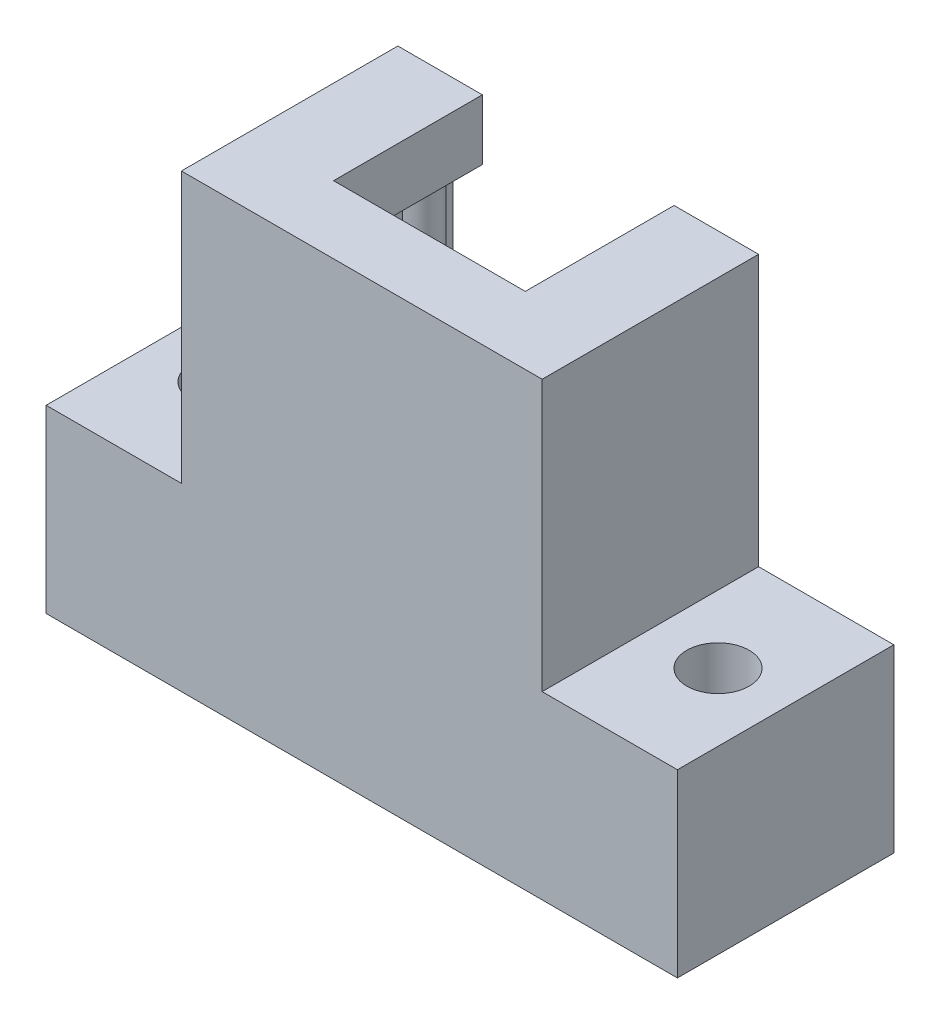
ISO-10303-21;
HEADER;
FILE_DESCRIPTION(('STEP AP214'),'2;1');
FILE_NAME('part.step','',(''),(''),'','','');
FILE_SCHEMA(('AUTOMOTIVE_DESIGN { 1 0 10303 214 1 1 1 1 }'));
ENDSEC;
DATA;
#1=APPLICATION_CONTEXT('core data for automotive mechanical design processes');
#2=APPLICATION_PROTOCOL_DEFINITION('international standard','automotive_design',2000,#1);
#3=PRODUCT_CONTEXT('',#1,'mechanical');
#4=PRODUCT('Part','Part','',(#3));
#5=PRODUCT_RELATED_PRODUCT_CATEGORY('part','',(#4));
#6=PRODUCT_DEFINITION_FORMATION('','',#4);
#7=PRODUCT_DEFINITION_CONTEXT('part definition',#1,'design');
#8=PRODUCT_DEFINITION('design','',#6,#7);
#9=PRODUCT_DEFINITION_SHAPE('','',#8);
#10=(LENGTH_UNIT() NAMED_UNIT(*) SI_UNIT(.MILLI.,.METRE.));
#11=(NAMED_UNIT(*) PLANE_ANGLE_UNIT() SI_UNIT($,.RADIAN.));
#12=(NAMED_UNIT(*) SI_UNIT($,.STERADIAN.) SOLID_ANGLE_UNIT());
#13=UNCERTAINTY_MEASURE_WITH_UNIT(LENGTH_MEASURE(1.E-05),#10,'distance_accuracy_value','');
#14=(GEOMETRIC_REPRESENTATION_CONTEXT(3) GLOBAL_UNCERTAINTY_ASSIGNED_CONTEXT((#13)) GLOBAL_UNIT_ASSIGNED_CONTEXT((#10,
#11,#12)) REPRESENTATION_CONTEXT('',''));
#15=CARTESIAN_POINT('',(0.,0.,0.));
#16=DIRECTION('',(0.,0.,1.));
#17=DIRECTION('',(1.,0.,0.));
#18=AXIS2_PLACEMENT_3D('',#15,#16,#17);
#19=CARTESIAN_POINT('',(-5.6799999999997,38.5185454322535,2.36500000000001));
#20=DIRECTION('',(0.,-1.,0.));
#21=DIRECTION('',(0.,0.,-1.));
#22=AXIS2_PLACEMENT_3D('',#19,#20,#21);
#23=CYLINDRICAL_SURFACE('',#22,1.25);
#24=DIRECTION('',(0.,-1.,0.));
#25=VECTOR('',#24,1.);
#26=CARTESIAN_POINT('',(-5.6799999999997,38.5185454322535,3.61500000000001));
#27=LINE('',#26,#25);
#28=CARTESIAN_POINT('',(-5.6799999999997,21.65,3.61500000000001));
#29=VERTEX_POINT('',#28);
#30=CARTESIAN_POINT('',(-5.6799999999997,8.71000000000003,3.61500000000001));
#31=VERTEX_POINT('',#30);
#32=EDGE_CURVE('E355',#29,#31,#27,.T.);
#33=ORIENTED_EDGE('',*,*,#32,.T.);
#34=CARTESIAN_POINT('',(-5.6799999999997,8.71000000000003,2.36500000000001));
#35=DIRECTION('',(0.,-1.,0.));
#36=DIRECTION('',(1.,0.,0.));
#37=AXIS2_PLACEMENT_3D('',#34,#35,#36);
#38=CIRCLE('',#37,1.25);
#39=CARTESIAN_POINT('',(-6.9299999999997,8.71000000000003,2.36500000000001));
#40=VERTEX_POINT('',#39);
#41=EDGE_CURVE('E281',#31,#40,#38,.T.);
#42=ORIENTED_EDGE('',*,*,#41,.T.);
#43=DIRECTION('',(0.,-1.,0.));
#44=VECTOR('',#43,1.);
#45=CARTESIAN_POINT('',(-6.9299999999997,38.5185454322535,2.36500000000001));
#46=LINE('',#45,#44);
#47=CARTESIAN_POINT('',(-6.9299999999997,21.65,2.36500000000001));
#48=VERTEX_POINT('',#47);
#49=EDGE_CURVE('E360',#48,#40,#46,.T.);
#50=ORIENTED_EDGE('',*,*,#49,.F.);
#51=CARTESIAN_POINT('',(-5.6799999999997,21.65,2.36500000000001));
#52=DIRECTION('',(0.,1.,0.));
#53=DIRECTION('',(-1.,0.,0.));
#54=AXIS2_PLACEMENT_3D('',#51,#52,#53);
#55=CIRCLE('',#54,1.25);
#56=EDGE_CURVE('E373',#48,#29,#55,.T.);
#57=ORIENTED_EDGE('',*,*,#56,.T.);
#58=EDGE_LOOP('',(#33,#42,#50,#57));
#59=FACE_BOUND('',#58,.T.);
#60=ADVANCED_FACE('F32',(#59),#23,.F.);
#61=CARTESIAN_POINT('',(5.68000000000027,38.5185454322535,3.61499999999999));
#62=DIRECTION('',(0.,0.,-1.));
#63=DIRECTION('',(-1.,0.,0.));
#64=AXIS2_PLACEMENT_3D('',#61,#62,#63);
#65=PLANE('',#64);
#66=DIRECTION('',(0.,-1.,0.));
#67=VECTOR('',#66,1.);
#68=CARTESIAN_POINT('',(5.68000000000027,38.5185454322535,3.61499999999999));
#69=LINE('',#68,#67);
#70=CARTESIAN_POINT('',(5.68000000000027,21.65,3.61499999999999));
#71=VERTEX_POINT('',#70);
#72=CARTESIAN_POINT('',(5.68000000000027,8.71000000000003,3.61499999999999));
#73=VERTEX_POINT('',#72);
#74=EDGE_CURVE('E350',#71,#73,#69,.T.);
#75=ORIENTED_EDGE('',*,*,#74,.T.);
#76=DIRECTION('',(-1.,0.,0.));
#77=VECTOR('',#76,1.);
#78=CARTESIAN_POINT('',(5.68000000000026,8.71000000000003,3.61499999999999));
#79=LINE('',#78,#77);
#80=EDGE_CURVE('E47',#73,#31,#79,.T.);
#81=ORIENTED_EDGE('',*,*,#80,.T.);
#82=ORIENTED_EDGE('',*,*,#32,.F.);
#83=DIRECTION('',(1.,0.,0.));
#84=VECTOR('',#83,1.);
#85=CARTESIAN_POINT('',(5.68000000000027,21.65,3.61499999999999));
#86=LINE('',#85,#84);
#87=EDGE_CURVE('E370',#29,#71,#86,.T.);
#88=ORIENTED_EDGE('',*,*,#87,.T.);
#89=EDGE_LOOP('',(#75,#81,#82,#88));
#90=FACE_BOUND('',#89,.T.);
#91=ADVANCED_FACE('F480',(#90),#65,.T.);
#92=CARTESIAN_POINT('',(5.68000000000027,38.5185454322535,2.36499999999996));
#93=DIRECTION('',(0.,-1.,0.));
#94=DIRECTION('',(0.,0.,-1.));
#95=AXIS2_PLACEMENT_3D('',#92,#93,#94);
#96=CYLINDRICAL_SURFACE('',#95,1.25000000000003);
#97=DIRECTION('',(0.,-1.,0.));
#98=VECTOR('',#97,1.);
#99=CARTESIAN_POINT('',(6.9300000000003,38.5185454322535,2.36499999999996));
#100=LINE('',#99,#98);
#101=CARTESIAN_POINT('',(6.9300000000003,21.65,2.36499999999996));
#102=VERTEX_POINT('',#101);
#103=CARTESIAN_POINT('',(6.9300000000003,8.71000000000003,2.36499999999996));
#104=VERTEX_POINT('',#103);
#105=EDGE_CURVE('E396',#102,#104,#100,.T.);
#106=ORIENTED_EDGE('',*,*,#105,.T.);
#107=CARTESIAN_POINT('',(5.68000000000027,8.71000000000003,2.36499999999996));
#108=DIRECTION('',(0.,-1.,0.));
#109=DIRECTION('',(1.,0.,0.));
#110=AXIS2_PLACEMENT_3D('',#107,#108,#109);
#111=CIRCLE('',#110,1.25000000000003);
#112=EDGE_CURVE('E244',#104,#73,#111,.T.);
#113=ORIENTED_EDGE('',*,*,#112,.T.);
#114=ORIENTED_EDGE('',*,*,#74,.F.);
#115=CARTESIAN_POINT('',(5.68000000000027,21.65,2.36499999999996));
#116=DIRECTION('',(0.,1.,0.));
#117=DIRECTION('',(-1.,0.,0.));
#118=AXIS2_PLACEMENT_3D('',#115,#116,#117);
#119=CIRCLE('',#118,1.25000000000003);
#120=EDGE_CURVE('E366',#71,#102,#119,.T.);
#121=ORIENTED_EDGE('',*,*,#120,.T.);
#122=EDGE_LOOP('',(#106,#113,#114,#121));
#123=FACE_BOUND('',#122,.T.);
#124=ADVANCED_FACE('F477',(#123),#96,.F.);
#125=CARTESIAN_POINT('',(-6.9299999999997,24.4784271247462,-4.17624949959959));
#126=DIRECTION('',(0.,-1.,0.));
#127=DIRECTION('',(0.,0.,-1.));
#128=AXIS2_PLACEMENT_3D('',#125,#126,#127);
#129=CYLINDRICAL_SURFACE('',#128,1.);
#130=DIRECTION('',(0.,-1.,0.));
#131=VECTOR('',#130,1.);
#132=CARTESIAN_POINT('',(-6.9299999999997,24.4784271247462,-3.17624949959959));
#133=LINE('',#132,#131);
#134=CARTESIAN_POINT('',(-6.9299999999997,21.65,-3.17624949959959));
#135=VERTEX_POINT('',#134);
#136=CARTESIAN_POINT('',(-6.9299999999997,8.71000000000003,-3.17624949959959));
#137=VERTEX_POINT('',#136);
#138=EDGE_CURVE('E313',#135,#137,#133,.T.);
#139=ORIENTED_EDGE('',*,*,#138,.T.);
#140=CARTESIAN_POINT('',(-6.9299999999997,8.71000000000003,-4.17624949959959));
#141=DIRECTION('',(0.,-1.,0.));
#142=DIRECTION('',(1.,0.,0.));
#143=AXIS2_PLACEMENT_3D('',#140,#141,#142);
#144=CIRCLE('',#143,1.);
#145=CARTESIAN_POINT('',(-6.9299999999997,8.71000000000003,-5.17624949959959));
#146=VERTEX_POINT('',#145);
#147=EDGE_CURVE('E258',#137,#146,#144,.F.);
#148=ORIENTED_EDGE('',*,*,#147,.T.);
#149=DIRECTION('',(0.,-1.,0.));
#150=VECTOR('',#149,1.);
#151=CARTESIAN_POINT('',(-6.9299999999997,24.4784271247462,-5.17624949959959));
#152=LINE('',#151,#150);
#153=CARTESIAN_POINT('',(-6.9299999999997,21.65,-5.17624949959959));
#154=VERTEX_POINT('',#153);
#155=EDGE_CURVE('E308',#146,#154,#152,.F.);
#156=ORIENTED_EDGE('',*,*,#155,.T.);
#157=CARTESIAN_POINT('',(-6.9299999999997,21.65,-4.17624949959959));
#158=DIRECTION('',(0.,1.,0.));
#159=DIRECTION('',(-1.,0.,0.));
#160=AXIS2_PLACEMENT_3D('',#157,#158,#159);
#161=CIRCLE('',#160,1.);
#162=EDGE_CURVE('E306',#154,#135,#161,.F.);
#163=ORIENTED_EDGE('',*,*,#162,.T.);
#164=EDGE_LOOP('',(#139,#148,#156,#163));
#165=FACE_BOUND('',#164,.T.);
#166=ADVANCED_FACE('F492',(#165),#129,.T.);
#167=CARTESIAN_POINT('',(6.9300000000003,24.4784271247462,-4.17624949959959));
#168=DIRECTION('',(0.,-1.,0.));
#169=DIRECTION('',(0.,0.,-1.));
#170=AXIS2_PLACEMENT_3D('',#167,#168,#169);
#171=CYLINDRICAL_SURFACE('',#170,1.);
#172=DIRECTION('',(0.,-1.,0.));
#173=VECTOR('',#172,1.);
#174=CARTESIAN_POINT('',(6.9300000000003,24.4784271247462,-5.17624949959959));
#175=LINE('',#174,#173);
#176=CARTESIAN_POINT('',(6.9300000000003,21.65,-5.17624949959959));
#177=VERTEX_POINT('',#176);
#178=CARTESIAN_POINT('',(6.9300000000003,8.71000000000003,-5.17624949959959));
#179=VERTEX_POINT('',#178);
#180=EDGE_CURVE('E300',#177,#179,#175,.T.);
#181=ORIENTED_EDGE('',*,*,#180,.T.);
#182=CARTESIAN_POINT('',(6.9300000000003,8.71000000000003,-4.17624949959959));
#183=DIRECTION('',(0.,-1.,0.));
#184=DIRECTION('',(1.,0.,0.));
#185=AXIS2_PLACEMENT_3D('',#182,#183,#184);
#186=CIRCLE('',#185,1.);
#187=CARTESIAN_POINT('',(6.9300000000003,8.71000000000003,-3.17624949959959));
#188=VERTEX_POINT('',#187);
#189=EDGE_CURVE('E40',#179,#188,#186,.F.);
#190=ORIENTED_EDGE('',*,*,#189,.T.);
#191=DIRECTION('',(0.,-1.,0.));
#192=VECTOR('',#191,1.);
#193=CARTESIAN_POINT('',(6.9300000000003,24.4784271247462,-3.17624949959959));
#194=LINE('',#193,#192);
#195=CARTESIAN_POINT('',(6.9300000000003,21.65,-3.17624949959959));
#196=VERTEX_POINT('',#195);
#197=EDGE_CURVE('E295',#188,#196,#194,.F.);
#198=ORIENTED_EDGE('',*,*,#197,.T.);
#199=CARTESIAN_POINT('',(6.9300000000003,21.65,-4.17624949959959));
#200=DIRECTION('',(0.,1.,0.));
#201=DIRECTION('',(-1.,0.,0.));
#202=AXIS2_PLACEMENT_3D('',#199,#200,#201);
#203=CIRCLE('',#202,1.);
#204=EDGE_CURVE('E462',#177,#196,#203,.T.);
#205=ORIENTED_EDGE('',*,*,#204,.F.);
#206=EDGE_LOOP('',(#181,#190,#198,#205));
#207=FACE_BOUND('',#206,.T.);
#208=ADVANCED_FACE('F467',(#207),#171,.T.);
#209=CARTESIAN_POINT('',(-17.5,10.,-6.));
#210=DIRECTION('',(0.,0.,1.));
#211=DIRECTION('',(1.,0.,0.));
#212=AXIS2_PLACEMENT_3D('',#209,#210,#211);
#213=PLANE('',#212);
#214=DIRECTION('',(-1.,0.,0.));
#215=VECTOR('',#214,1.);
#216=CARTESIAN_POINT('',(-6.9299999999997,21.65,-6.));
#217=LINE('',#216,#215);
#218=CARTESIAN_POINT('',(6.9300000000003,21.65,-6.));
#219=VERTEX_POINT('',#218);
#220=CARTESIAN_POINT('',(5.3150000000003,21.65,-6.));
#221=VERTEX_POINT('',#220);
#222=EDGE_CURVE('E380',#219,#221,#217,.T.);
#223=ORIENTED_EDGE('',*,*,#222,.T.);
#224=DIRECTION('',(0.,1.,0.));
#225=VECTOR('',#224,1.);
#226=CARTESIAN_POINT('',(5.3150000000003,8.19416855040168,-6.));
#227=LINE('',#226,#225);
#228=CARTESIAN_POINT('',(5.3150000000003,25.,-6.));
#229=VERTEX_POINT('',#228);
#230=EDGE_CURVE('E321',#221,#229,#227,.T.);
#231=ORIENTED_EDGE('',*,*,#230,.T.);
#232=DIRECTION('',(-1.,0.,0.));
#233=VECTOR('',#232,1.);
#234=CARTESIAN_POINT('',(-10.,25.,-6.));
#235=LINE('',#234,#233);
#236=CARTESIAN_POINT('',(10.,25.,-6.));
#237=VERTEX_POINT('',#236);
#238=EDGE_CURVE('E403',#237,#229,#235,.T.);
#239=ORIENTED_EDGE('',*,*,#238,.F.);
#240=DIRECTION('',(0.,-1.,0.));
#241=VECTOR('',#240,1.);
#242=CARTESIAN_POINT('',(10.,25.,-6.));
#243=LINE('',#242,#241);
#244=CARTESIAN_POINT('',(10.,10.,-6.));
#245=VERTEX_POINT('',#244);
#246=EDGE_CURVE('E419',#237,#245,#243,.T.);
#247=ORIENTED_EDGE('',*,*,#246,.T.);
#248=DIRECTION('',(-1.,0.,0.));
#249=VECTOR('',#248,1.);
#250=CARTESIAN_POINT('',(-17.5,10.,-6.));
#251=LINE('',#250,#249);
#252=CARTESIAN_POINT('',(17.5,10.,-6.));
#253=VERTEX_POINT('',#252);
#254=EDGE_CURVE('E434',#253,#245,#251,.T.);
#255=ORIENTED_EDGE('',*,*,#254,.F.);
#256=DIRECTION('',(0.,-1.,0.));
#257=VECTOR('',#256,1.);
#258=CARTESIAN_POINT('',(17.5,10.,-6.));
#259=LINE('',#258,#257);
#260=CARTESIAN_POINT('',(17.5,0.,-6.));
#261=VERTEX_POINT('',#260);
#262=EDGE_CURVE('E459',#253,#261,#259,.T.);
#263=ORIENTED_EDGE('',*,*,#262,.T.);
#264=DIRECTION('',(-1.,0.,0.));
#265=VECTOR('',#264,1.);
#266=CARTESIAN_POINT('',(-17.5,0.,-6.));
#267=LINE('',#266,#265);
#268=CARTESIAN_POINT('',(6.9300000000003,0.,-6.));
#269=VERTEX_POINT('',#268);
#270=EDGE_CURVE('E445',#261,#269,#267,.T.);
#271=ORIENTED_EDGE('',*,*,#270,.T.);
#272=DIRECTION('',(0.,-1.,0.));
#273=VECTOR('',#272,1.);
#274=CARTESIAN_POINT('',(6.9300000000003,38.5185454322535,-6.));
#275=LINE('',#274,#273);
#276=EDGE_CURVE('E340',#219,#269,#275,.T.);
#277=ORIENTED_EDGE('',*,*,#276,.F.);
#278=EDGE_LOOP('',(#223,#231,#239,#247,#255,#263,#271,#277));
#279=FACE_BOUND('',#278,.T.);
#280=ADVANCED_FACE('F542',(#279),#213,.F.);
#281=CARTESIAN_POINT('',(-5.3149999999997,25.,-6.));
#282=VERTEX_POINT('',#281);
#283=CARTESIAN_POINT('',(-10.,25.,-6.));
#284=VERTEX_POINT('',#283);
#285=EDGE_CURVE('E402',#282,#284,#235,.T.);
#286=ORIENTED_EDGE('',*,*,#285,.F.);
#287=DIRECTION('',(0.,1.,0.));
#288=VECTOR('',#287,1.);
#289=CARTESIAN_POINT('',(-5.3149999999997,8.19416855040168,-6.));
#290=LINE('',#289,#288);
#291=CARTESIAN_POINT('',(-5.3149999999997,21.65,-6.));
#292=VERTEX_POINT('',#291);
#293=EDGE_CURVE('E331',#292,#282,#290,.T.);
#294=ORIENTED_EDGE('',*,*,#293,.F.);
#295=CARTESIAN_POINT('',(-6.9299999999997,21.65,-6.));
#296=VERTEX_POINT('',#295);
#297=EDGE_CURVE('E383',#292,#296,#217,.T.);
#298=ORIENTED_EDGE('',*,*,#297,.T.);
#299=DIRECTION('',(0.,-1.,0.));
#300=VECTOR('',#299,1.);
#301=CARTESIAN_POINT('',(-6.9299999999997,38.5185454322535,-6.));
#302=LINE('',#301,#300);
#303=CARTESIAN_POINT('',(-6.9299999999997,0.,-6.));
#304=VERTEX_POINT('',#303);
#305=EDGE_CURVE('E387',#296,#304,#302,.T.);
#306=ORIENTED_EDGE('',*,*,#305,.T.);
#307=CARTESIAN_POINT('',(-17.5,0.,-6.));
#308=VERTEX_POINT('',#307);
#309=EDGE_CURVE('E444',#304,#308,#267,.T.);
#310=ORIENTED_EDGE('',*,*,#309,.T.);
#311=DIRECTION('',(0.,-1.,0.));
#312=VECTOR('',#311,1.);
#313=CARTESIAN_POINT('',(-17.5,10.,-6.));
#314=LINE('',#313,#312);
#315=CARTESIAN_POINT('',(-17.5,10.,-6.));
#316=VERTEX_POINT('',#315);
#317=EDGE_CURVE('E456',#316,#308,#314,.T.);
#318=ORIENTED_EDGE('',*,*,#317,.F.);
#319=CARTESIAN_POINT('',(-10.,10.,-6.));
#320=VERTEX_POINT('',#319);
#321=EDGE_CURVE('E432',#320,#316,#251,.T.);
#322=ORIENTED_EDGE('',*,*,#321,.F.);
#323=DIRECTION('',(0.,-1.,0.));
#324=VECTOR('',#323,1.);
#325=CARTESIAN_POINT('',(-10.,25.,-6.));
#326=LINE('',#325,#324);
#327=EDGE_CURVE('E416',#284,#320,#326,.T.);
#328=ORIENTED_EDGE('',*,*,#327,.F.);
#329=EDGE_LOOP('',(#286,#294,#298,#306,#310,#318,#322,#328));
#330=FACE_BOUND('',#329,.T.);
#331=ADVANCED_FACE('F500',(#330),#213,.F.);
#332=CARTESIAN_POINT('',(0.,0.,0.));
#333=DIRECTION('',(0.,-1.,0.));
#334=DIRECTION('',(0.,0.,-1.));
#335=AXIS2_PLACEMENT_3D('',#332,#333,#334);
#336=PLANE('',#335);
#337=CARTESIAN_POINT('',(-13.75,0.,0.));
#338=DIRECTION('',(0.,1.,0.));
#339=DIRECTION('',(0.,0.,1.));
#340=AXIS2_PLACEMENT_3D('',#337,#338,#339);
#341=CIRCLE('',#340,1.7272);
#342=CARTESIAN_POINT('',(-13.75,0.,1.7272));
#343=VERTEX_POINT('',#342);
#344=EDGE_CURVE('E805',#343,#343,#341,.T.);
#345=ORIENTED_EDGE('',*,*,#344,.T.);
#346=EDGE_LOOP('',(#345));
#347=FACE_BOUND('',#346,.T.);
#348=CARTESIAN_POINT('',(13.75,0.,0.));
#349=DIRECTION('',(0.,1.,0.));
#350=DIRECTION('',(0.,0.,1.));
#351=AXIS2_PLACEMENT_3D('',#348,#349,#350);
#352=CIRCLE('',#351,1.7272);
#353=CARTESIAN_POINT('',(13.75,0.,1.7272));
#354=VERTEX_POINT('',#353);
#355=EDGE_CURVE('E248',#354,#354,#352,.T.);
#356=ORIENTED_EDGE('',*,*,#355,.T.);
#357=EDGE_LOOP('',(#356));
#358=FACE_BOUND('',#357,.T.);
#359=DIRECTION('',(0.,0.,-1.));
#360=VECTOR('',#359,1.);
#361=CARTESIAN_POINT('',(6.9300000000003,0.,-6.));
#362=LINE('',#361,#360);
#363=CARTESIAN_POINT('',(6.9300000000003,0.,2.36499999999996));
#364=VERTEX_POINT('',#363);
#365=CARTESIAN_POINT('',(6.9300000000003,0.,-3.17624949959959));
#366=VERTEX_POINT('',#365);
#367=EDGE_CURVE('E341',#364,#366,#362,.T.);
#368=ORIENTED_EDGE('',*,*,#367,.T.);
#369=CARTESIAN_POINT('',(6.9300000000003,0.,-4.17624949959959));
#370=DIRECTION('',(0.,-1.,0.));
#371=DIRECTION('',(0.,0.,-1.));
#372=AXIS2_PLACEMENT_3D('',#369,#370,#371);
#373=CIRCLE('',#372,1.);
#374=CARTESIAN_POINT('',(6.9300000000003,0.,-5.17624949959959));
#375=VERTEX_POINT('',#374);
#376=EDGE_CURVE('E292',#366,#375,#373,.T.);
#377=ORIENTED_EDGE('',*,*,#376,.T.);
#378=EDGE_CURVE('E345',#375,#269,#362,.T.);
#379=ORIENTED_EDGE('',*,*,#378,.T.);
#380=ORIENTED_EDGE('',*,*,#270,.F.);
#381=DIRECTION('',(0.,0.,-1.));
#382=VECTOR('',#381,1.);
#383=CARTESIAN_POINT('',(17.5,0.,6.));
#384=LINE('',#383,#382);
#385=CARTESIAN_POINT('',(17.5,0.,6.));
#386=VERTEX_POINT('',#385);
#387=EDGE_CURVE('E428',#386,#261,#384,.T.);
#388=ORIENTED_EDGE('',*,*,#387,.F.);
#389=DIRECTION('',(1.,0.,0.));
#390=VECTOR('',#389,1.);
#391=CARTESIAN_POINT('',(-17.5,0.,6.));
#392=LINE('',#391,#390);
#393=CARTESIAN_POINT('',(-17.5,0.,6.));
#394=VERTEX_POINT('',#393);
#395=EDGE_CURVE('E433',#394,#386,#392,.T.);
#396=ORIENTED_EDGE('',*,*,#395,.F.);
#397=DIRECTION('',(0.,0.,1.));
#398=VECTOR('',#397,1.);
#399=CARTESIAN_POINT('',(-17.5,0.,6.));
#400=LINE('',#399,#398);
#401=EDGE_CURVE('E448',#308,#394,#400,.T.);
#402=ORIENTED_EDGE('',*,*,#401,.F.);
#403=ORIENTED_EDGE('',*,*,#309,.F.);
#404=DIRECTION('',(0.,0.,1.));
#405=VECTOR('',#404,1.);
#406=CARTESIAN_POINT('',(-6.9299999999997,0.,2.36500000000001));
#407=LINE('',#406,#405);
#408=CARTESIAN_POINT('',(-6.9299999999997,0.,-5.17624949959959));
#409=VERTEX_POINT('',#408);
#410=EDGE_CURVE('E361',#304,#409,#407,.T.);
#411=ORIENTED_EDGE('',*,*,#410,.T.);
#412=CARTESIAN_POINT('',(-6.9299999999997,0.,-4.17624949959959));
#413=DIRECTION('',(0.,-1.,0.));
#414=DIRECTION('',(0.,0.,-1.));
#415=AXIS2_PLACEMENT_3D('',#412,#413,#414);
#416=CIRCLE('',#415,1.);
#417=CARTESIAN_POINT('',(-6.9299999999997,0.,-3.17624949959959));
#418=VERTEX_POINT('',#417);
#419=EDGE_CURVE('E303',#409,#418,#416,.T.);
#420=ORIENTED_EDGE('',*,*,#419,.T.);
#421=CARTESIAN_POINT('',(-6.9299999999997,0.,2.36500000000001));
#422=VERTEX_POINT('',#421);
#423=EDGE_CURVE('E365',#418,#422,#407,.T.);
#424=ORIENTED_EDGE('',*,*,#423,.T.);
#425=CARTESIAN_POINT('',(-5.6799999999997,0.,2.36500000000001));
#426=DIRECTION('',(0.,1.,0.));
#427=DIRECTION('',(0.,0.,-1.));
#428=AXIS2_PLACEMENT_3D('',#425,#426,#427);
#429=CIRCLE('',#428,1.25);
#430=CARTESIAN_POINT('',(-5.6799999999997,0.,3.61500000000001));
#431=VERTEX_POINT('',#430);
#432=EDGE_CURVE('E356',#422,#431,#429,.T.);
#433=ORIENTED_EDGE('',*,*,#432,.T.);
#434=DIRECTION('',(1.,0.,0.));
#435=VECTOR('',#434,1.);
#436=CARTESIAN_POINT('',(5.68000000000027,0.,3.61499999999999));
#437=LINE('',#436,#435);
#438=CARTESIAN_POINT('',(5.68000000000027,0.,3.61499999999999));
#439=VERTEX_POINT('',#438);
#440=EDGE_CURVE('E351',#431,#439,#437,.T.);
#441=ORIENTED_EDGE('',*,*,#440,.T.);
#442=CARTESIAN_POINT('',(5.68000000000027,0.,2.36499999999996));
#443=DIRECTION('',(0.,1.,0.));
#444=DIRECTION('',(0.,0.,-1.));
#445=AXIS2_PLACEMENT_3D('',#442,#443,#444);
#446=CIRCLE('',#445,1.25000000000003);
#447=EDGE_CURVE('E346',#439,#364,#446,.T.);
#448=ORIENTED_EDGE('',*,*,#447,.T.);
#449=EDGE_LOOP('',(#368,#377,#379,#380,#388,#396,#402,#403,#411,#420,#424,#433,#441,#448));
#450=FACE_BOUND('',#449,.T.);
#451=ADVANCED_FACE('F505',(#347,#358,#450),#336,.T.);
#452=CARTESIAN_POINT('',(0.,10.,0.));
#453=DIRECTION('',(0.,-1.,0.));
#454=DIRECTION('',(0.,0.,-1.));
#455=AXIS2_PLACEMENT_3D('',#452,#453,#454);
#456=PLANE('',#455);
#457=CARTESIAN_POINT('',(13.75,10.,0.));
#458=DIRECTION('',(0.,1.,0.));
#459=DIRECTION('',(0.,0.,1.));
#460=AXIS2_PLACEMENT_3D('',#457,#458,#459);
#461=CIRCLE('',#460,1.7272);
#462=CARTESIAN_POINT('',(13.75,10.,1.7272));
#463=VERTEX_POINT('',#462);
#464=EDGE_CURVE('E810',#463,#463,#461,.T.);
#465=ORIENTED_EDGE('',*,*,#464,.F.);
#466=EDGE_LOOP('',(#465));
#467=FACE_BOUND('',#466,.T.);
#468=DIRECTION('',(0.,0.,-1.));
#469=VECTOR('',#468,1.);
#470=CARTESIAN_POINT('',(10.,10.,0.));
#471=LINE('',#470,#469);
#472=CARTESIAN_POINT('',(10.,10.,6.));
#473=VERTEX_POINT('',#472);
#474=EDGE_CURVE('E425',#473,#245,#471,.T.);
#475=ORIENTED_EDGE('',*,*,#474,.F.);
#476=DIRECTION('',(1.,0.,0.));
#477=VECTOR('',#476,1.);
#478=CARTESIAN_POINT('',(-17.5,10.,6.));
#479=LINE('',#478,#477);
#480=CARTESIAN_POINT('',(17.5,10.,6.));
#481=VERTEX_POINT('',#480);
#482=EDGE_CURVE('E438',#473,#481,#479,.T.);
#483=ORIENTED_EDGE('',*,*,#482,.T.);
#484=DIRECTION('',(0.,0.,-1.));
#485=VECTOR('',#484,1.);
#486=CARTESIAN_POINT('',(17.5,10.,6.));
#487=LINE('',#486,#485);
#488=EDGE_CURVE('E429',#481,#253,#487,.T.);
#489=ORIENTED_EDGE('',*,*,#488,.T.);
#490=ORIENTED_EDGE('',*,*,#254,.T.);
#491=EDGE_LOOP('',(#475,#483,#489,#490));
#492=FACE_BOUND('',#491,.T.);
#493=ADVANCED_FACE('F553',(#467,#492),#456,.F.);
#494=CARTESIAN_POINT('',(-13.75,10.,0.));
#495=DIRECTION('',(0.,1.,0.));
#496=DIRECTION('',(0.,0.,1.));
#497=AXIS2_PLACEMENT_3D('',#494,#495,#496);
#498=CIRCLE('',#497,1.7272);
#499=CARTESIAN_POINT('',(-13.75,10.,1.7272));
#500=VERTEX_POINT('',#499);
#501=EDGE_CURVE('E808',#500,#500,#498,.T.);
#502=ORIENTED_EDGE('',*,*,#501,.F.);
#503=EDGE_LOOP('',(#502));
#504=FACE_BOUND('',#503,.T.);
#505=DIRECTION('',(0.,0.,1.));
#506=VECTOR('',#505,1.);
#507=CARTESIAN_POINT('',(-10.,10.,0.));
#508=LINE('',#507,#506);
#509=CARTESIAN_POINT('',(-10.,10.,6.));
#510=VERTEX_POINT('',#509);
#511=EDGE_CURVE('E422',#320,#510,#508,.T.);
#512=ORIENTED_EDGE('',*,*,#511,.F.);
#513=ORIENTED_EDGE('',*,*,#321,.T.);
#514=DIRECTION('',(0.,0.,1.));
#515=VECTOR('',#514,1.);
#516=CARTESIAN_POINT('',(-17.5,10.,6.));
#517=LINE('',#516,#515);
#518=CARTESIAN_POINT('',(-17.5,10.,6.));
#519=VERTEX_POINT('',#518);
#520=EDGE_CURVE('E436',#316,#519,#517,.T.);
#521=ORIENTED_EDGE('',*,*,#520,.T.);
#522=EDGE_CURVE('E439',#519,#510,#479,.T.);
#523=ORIENTED_EDGE('',*,*,#522,.T.);
#524=EDGE_LOOP('',(#512,#513,#521,#523));
#525=FACE_BOUND('',#524,.T.);
#526=ADVANCED_FACE('F519',(#504,#525),#456,.F.);
#527=CARTESIAN_POINT('',(17.5,10.,6.));
#528=DIRECTION('',(-1.,0.,0.));
#529=DIRECTION('',(0.,0.,1.));
#530=AXIS2_PLACEMENT_3D('',#527,#528,#529);
#531=PLANE('',#530);
#532=ORIENTED_EDGE('',*,*,#387,.T.);
#533=ORIENTED_EDGE('',*,*,#262,.F.);
#534=ORIENTED_EDGE('',*,*,#488,.F.);
#535=DIRECTION('',(0.,-1.,0.));
#536=VECTOR('',#535,1.);
#537=CARTESIAN_POINT('',(17.5,10.,6.));
#538=LINE('',#537,#536);
#539=EDGE_CURVE('E441',#481,#386,#538,.T.);
#540=ORIENTED_EDGE('',*,*,#539,.T.);
#541=EDGE_LOOP('',(#532,#533,#534,#540));
#542=FACE_BOUND('',#541,.T.);
#543=ADVANCED_FACE('F34',(#542),#531,.F.);
#544=CARTESIAN_POINT('',(-17.5,10.,6.));
#545=DIRECTION('',(1.,0.,0.));
#546=DIRECTION('',(0.,0.,-1.));
#547=AXIS2_PLACEMENT_3D('',#544,#545,#546);
#548=PLANE('',#547);
#549=ORIENTED_EDGE('',*,*,#401,.T.);
#550=DIRECTION('',(0.,-1.,0.));
#551=VECTOR('',#550,1.);
#552=CARTESIAN_POINT('',(-17.5,10.,6.));
#553=LINE('',#552,#551);
#554=EDGE_CURVE('E453',#519,#394,#553,.T.);
#555=ORIENTED_EDGE('',*,*,#554,.F.);
#556=ORIENTED_EDGE('',*,*,#520,.F.);
#557=ORIENTED_EDGE('',*,*,#317,.T.);
#558=EDGE_LOOP('',(#549,#555,#556,#557));
#559=FACE_BOUND('',#558,.T.);
#560=ADVANCED_FACE('F510',(#559),#548,.F.);
#561=CARTESIAN_POINT('',(-17.5,10.,6.));
#562=DIRECTION('',(0.,0.,-1.));
#563=DIRECTION('',(-1.,0.,0.));
#564=AXIS2_PLACEMENT_3D('',#561,#562,#563);
#565=PLANE('',#564);
#566=ORIENTED_EDGE('',*,*,#395,.T.);
#567=ORIENTED_EDGE('',*,*,#539,.F.);
#568=ORIENTED_EDGE('',*,*,#482,.F.);
#569=DIRECTION('',(0.,-1.,0.));
#570=VECTOR('',#569,1.);
#571=CARTESIAN_POINT('',(10.,25.,6.));
#572=LINE('',#571,#570);
#573=CARTESIAN_POINT('',(10.,25.,6.));
#574=VERTEX_POINT('',#573);
#575=EDGE_CURVE('E410',#574,#473,#572,.T.);
#576=ORIENTED_EDGE('',*,*,#575,.F.);
#577=DIRECTION('',(1.,0.,0.));
#578=VECTOR('',#577,1.);
#579=CARTESIAN_POINT('',(-10.,25.,6.));
#580=LINE('',#579,#578);
#581=CARTESIAN_POINT('',(-10.,25.,6.));
#582=VERTEX_POINT('',#581);
#583=EDGE_CURVE('E408',#582,#574,#580,.T.);
#584=ORIENTED_EDGE('',*,*,#583,.F.);
#585=DIRECTION('',(0.,-1.,0.));
#586=VECTOR('',#585,1.);
#587=CARTESIAN_POINT('',(-10.,25.,6.));
#588=LINE('',#587,#586);
#589=EDGE_CURVE('E413',#582,#510,#588,.T.);
#590=ORIENTED_EDGE('',*,*,#589,.T.);
#591=ORIENTED_EDGE('',*,*,#522,.F.);
#592=ORIENTED_EDGE('',*,*,#554,.T.);
#593=EDGE_LOOP('',(#566,#567,#568,#576,#584,#590,#591,#592));
#594=FACE_BOUND('',#593,.T.);
#595=ADVANCED_FACE('F514',(#594),#565,.F.);
#596=CARTESIAN_POINT('',(10.,25.,6.));
#597=DIRECTION('',(-1.,0.,0.));
#598=DIRECTION('',(0.,0.,1.));
#599=AXIS2_PLACEMENT_3D('',#596,#597,#598);
#600=PLANE('',#599);
#601=ORIENTED_EDGE('',*,*,#575,.T.);
#602=ORIENTED_EDGE('',*,*,#474,.T.);
#603=ORIENTED_EDGE('',*,*,#246,.F.);
#604=DIRECTION('',(0.,0.,-1.));
#605=VECTOR('',#604,1.);
#606=CARTESIAN_POINT('',(10.,25.,6.));
#607=LINE('',#606,#605);
#608=EDGE_CURVE('E369',#574,#237,#607,.T.);
#609=ORIENTED_EDGE('',*,*,#608,.F.);
#610=EDGE_LOOP('',(#601,#602,#603,#609));
#611=FACE_BOUND('',#610,.T.);
#612=ADVANCED_FACE('F548',(#611),#600,.F.);
#613=CARTESIAN_POINT('',(-10.,25.,6.));
#614=DIRECTION('',(1.,0.,0.));
#615=DIRECTION('',(0.,0.,-1.));
#616=AXIS2_PLACEMENT_3D('',#613,#614,#615);
#617=PLANE('',#616);
#618=ORIENTED_EDGE('',*,*,#327,.T.);
#619=ORIENTED_EDGE('',*,*,#511,.T.);
#620=ORIENTED_EDGE('',*,*,#589,.F.);
#621=DIRECTION('',(0.,0.,1.));
#622=VECTOR('',#621,1.);
#623=CARTESIAN_POINT('',(-10.,25.,6.));
#624=LINE('',#623,#622);
#625=EDGE_CURVE('E406',#284,#582,#624,.T.);
#626=ORIENTED_EDGE('',*,*,#625,.F.);
#627=EDGE_LOOP('',(#618,#619,#620,#626));
#628=FACE_BOUND('',#627,.T.);
#629=ADVANCED_FACE('F522',(#628),#617,.F.);
#630=CARTESIAN_POINT('',(0.,25.,0.));
#631=DIRECTION('',(0.,-1.,0.));
#632=DIRECTION('',(0.,0.,-1.));
#633=AXIS2_PLACEMENT_3D('',#630,#631,#632);
#634=PLANE('',#633);
#635=ORIENTED_EDGE('',*,*,#238,.T.);
#636=DIRECTION('',(0.,0.,-1.));
#637=VECTOR('',#636,1.);
#638=CARTESIAN_POINT('',(5.3150000000003,25.,2.25000000000001));
#639=LINE('',#638,#637);
#640=CARTESIAN_POINT('',(5.3150000000003,25.,2.25000000000001));
#641=VERTEX_POINT('',#640);
#642=EDGE_CURVE('E329',#641,#229,#639,.T.);
#643=ORIENTED_EDGE('',*,*,#642,.F.);
#644=DIRECTION('',(1.,0.,0.));
#645=VECTOR('',#644,1.);
#646=CARTESIAN_POINT('',(-5.3149999999997,25.,2.25000000000001));
#647=LINE('',#646,#645);
#648=CARTESIAN_POINT('',(-5.3149999999997,25.,2.25000000000001));
#649=VERTEX_POINT('',#648);
#650=EDGE_CURVE('E326',#649,#641,#647,.T.);
#651=ORIENTED_EDGE('',*,*,#650,.F.);
#652=DIRECTION('',(0.,0.,1.));
#653=VECTOR('',#652,1.);
#654=CARTESIAN_POINT('',(-5.3149999999997,25.,-6.));
#655=LINE('',#654,#653);
#656=EDGE_CURVE('E316',#282,#649,#655,.T.);
#657=ORIENTED_EDGE('',*,*,#656,.F.);
#658=ORIENTED_EDGE('',*,*,#285,.T.);
#659=ORIENTED_EDGE('',*,*,#625,.T.);
#660=ORIENTED_EDGE('',*,*,#583,.T.);
#661=ORIENTED_EDGE('',*,*,#608,.T.);
#662=EDGE_LOOP('',(#635,#643,#651,#657,#658,#659,#660,#661));
#663=FACE_BOUND('',#662,.T.);
#664=ADVANCED_FACE('F527',(#663),#634,.F.);
#665=CARTESIAN_POINT('',(-6.9299999999997,38.5185454322535,2.36500000000001));
#666=DIRECTION('',(1.,0.,0.));
#667=DIRECTION('',(0.,0.,-1.));
#668=AXIS2_PLACEMENT_3D('',#665,#666,#667);
#669=PLANE('',#668);
#670=DIRECTION('',(0.,0.,-1.));
#671=VECTOR('',#670,1.);
#672=CARTESIAN_POINT('',(-6.9299999999997,6.71000000000003,-5.42499999999999));
#673=LINE('',#672,#671);
#674=CARTESIAN_POINT('',(-6.9299999999997,6.71000000000003,-3.17624949959959));
#675=VERTEX_POINT('',#674);
#676=CARTESIAN_POINT('',(-6.9299999999997,6.71000000000003,-5.17624949959959));
#677=VERTEX_POINT('',#676);
#678=EDGE_CURVE('E273',#675,#677,#673,.T.);
#679=ORIENTED_EDGE('',*,*,#678,.T.);
#680=EDGE_CURVE('E309',#409,#677,#152,.F.);
#681=ORIENTED_EDGE('',*,*,#680,.F.);
#682=ORIENTED_EDGE('',*,*,#410,.F.);
#683=ORIENTED_EDGE('',*,*,#305,.F.);
#684=DIRECTION('',(0.,0.,1.));
#685=VECTOR('',#684,1.);
#686=CARTESIAN_POINT('',(-6.9299999999997,21.65,2.36500000000001));
#687=LINE('',#686,#685);
#688=EDGE_CURVE('E376',#296,#154,#687,.T.);
#689=ORIENTED_EDGE('',*,*,#688,.T.);
#690=ORIENTED_EDGE('',*,*,#155,.F.);
#691=DIRECTION('',(0.,0.,-1.));
#692=VECTOR('',#691,1.);
#693=CARTESIAN_POINT('',(-6.9299999999997,8.71000000000003,-5.42499999999999));
#694=LINE('',#693,#692);
#695=EDGE_CURVE('E54',#137,#146,#694,.T.);
#696=ORIENTED_EDGE('',*,*,#695,.F.);
#697=ORIENTED_EDGE('',*,*,#138,.F.);
#698=EDGE_CURVE('E379',#135,#48,#687,.T.);
#699=ORIENTED_EDGE('',*,*,#698,.T.);
#700=ORIENTED_EDGE('',*,*,#49,.T.);
#701=CARTESIAN_POINT('',(-6.9299999999997,8.71000000000003,5.425));
#702=VERTEX_POINT('',#701);
#703=EDGE_CURVE('E265',#702,#40,#694,.T.);
#704=ORIENTED_EDGE('',*,*,#703,.F.);
#705=DIRECTION('',(0.,1.,0.));
#706=VECTOR('',#705,1.);
#707=CARTESIAN_POINT('',(-6.9299999999997,6.71000000000003,5.425));
#708=LINE('',#707,#706);
#709=CARTESIAN_POINT('',(-6.9299999999997,6.71000000000003,5.425));
#710=VERTEX_POINT('',#709);
#711=EDGE_CURVE('E259',#710,#702,#708,.T.);
#712=ORIENTED_EDGE('',*,*,#711,.F.);
#713=CARTESIAN_POINT('',(-6.9299999999997,6.71000000000003,2.36500000000001));
#714=VERTEX_POINT('',#713);
#715=EDGE_CURVE('E274',#710,#714,#673,.T.);
#716=ORIENTED_EDGE('',*,*,#715,.T.);
#717=EDGE_CURVE('E364',#714,#422,#46,.T.);
#718=ORIENTED_EDGE('',*,*,#717,.T.);
#719=ORIENTED_EDGE('',*,*,#423,.F.);
#720=EDGE_CURVE('E312',#675,#418,#133,.T.);
#721=ORIENTED_EDGE('',*,*,#720,.F.);
#722=EDGE_LOOP('',(#679,#681,#682,#683,#689,#690,#696,#697,#699,#700,#704,#712,#716,#718,#719,#721));
#723=FACE_BOUND('',#722,.T.);
#724=ADVANCED_FACE('F488',(#723),#669,.T.);
#725=CARTESIAN_POINT('',(-5.6799999999997,6.71000000000003,2.36500000000001));
#726=DIRECTION('',(0.,-1.,0.));
#727=DIRECTION('',(1.,0.,0.));
#728=AXIS2_PLACEMENT_3D('',#725,#726,#727);
#729=CIRCLE('',#728,1.25);
#730=CARTESIAN_POINT('',(-5.6799999999997,6.71000000000003,3.61500000000001));
#731=VERTEX_POINT('',#730);
#732=EDGE_CURVE('E290',#731,#714,#729,.T.);
#733=ORIENTED_EDGE('',*,*,#732,.F.);
#734=EDGE_CURVE('E359',#731,#431,#27,.T.);
#735=ORIENTED_EDGE('',*,*,#734,.T.);
#736=ORIENTED_EDGE('',*,*,#432,.F.);
#737=ORIENTED_EDGE('',*,*,#717,.F.);
#738=EDGE_LOOP('',(#733,#735,#736,#737));
#739=FACE_BOUND('',#738,.T.);
#740=ADVANCED_FACE('F577',(#739),#23,.F.);
#741=DIRECTION('',(-1.,0.,0.));
#742=VECTOR('',#741,1.);
#743=CARTESIAN_POINT('',(5.68000000000026,6.71000000000003,3.61499999999999));
#744=LINE('',#743,#742);
#745=CARTESIAN_POINT('',(5.68000000000027,6.71000000000003,3.61499999999999));
#746=VERTEX_POINT('',#745);
#747=EDGE_CURVE('E288',#746,#731,#744,.T.);
#748=ORIENTED_EDGE('',*,*,#747,.F.);
#749=EDGE_CURVE('E354',#746,#439,#69,.T.);
#750=ORIENTED_EDGE('',*,*,#749,.T.);
#751=ORIENTED_EDGE('',*,*,#440,.F.);
#752=ORIENTED_EDGE('',*,*,#734,.F.);
#753=EDGE_LOOP('',(#748,#750,#751,#752));
#754=FACE_BOUND('',#753,.T.);
#755=ADVANCED_FACE('F573',(#754),#65,.T.);
#756=CARTESIAN_POINT('',(5.68000000000027,6.71000000000003,2.36499999999996));
#757=DIRECTION('',(0.,-1.,0.));
#758=DIRECTION('',(1.,0.,0.));
#759=AXIS2_PLACEMENT_3D('',#756,#757,#758);
#760=CIRCLE('',#759,1.25000000000003);
#761=CARTESIAN_POINT('',(6.9300000000003,6.71000000000003,2.36499999999996));
#762=VERTEX_POINT('',#761);
#763=EDGE_CURVE('E286',#762,#746,#760,.T.);
#764=ORIENTED_EDGE('',*,*,#763,.F.);
#765=EDGE_CURVE('E349',#762,#364,#100,.T.);
#766=ORIENTED_EDGE('',*,*,#765,.T.);
#767=ORIENTED_EDGE('',*,*,#447,.F.);
#768=ORIENTED_EDGE('',*,*,#749,.F.);
#769=EDGE_LOOP('',(#764,#766,#767,#768));
#770=FACE_BOUND('',#769,.T.);
#771=ADVANCED_FACE('F565',(#770),#96,.F.);
#772=CARTESIAN_POINT('',(6.9300000000003,38.5185454322535,-6.));
#773=DIRECTION('',(-1.,0.,0.));
#774=DIRECTION('',(0.,0.,1.));
#775=AXIS2_PLACEMENT_3D('',#772,#773,#774);
#776=PLANE('',#775);
#777=CARTESIAN_POINT('',(6.9300000000003,6.71000000000003,-5.17624949959959));
#778=VERTEX_POINT('',#777);
#779=EDGE_CURVE('E299',#778,#375,#175,.T.);
#780=ORIENTED_EDGE('',*,*,#779,.F.);
#781=DIRECTION('',(0.,0.,1.));
#782=VECTOR('',#781,1.);
#783=CARTESIAN_POINT('',(6.9300000000003,6.71000000000003,-5.42499999999999));
#784=LINE('',#783,#782);
#785=CARTESIAN_POINT('',(6.9300000000003,6.71000000000003,-3.17624949959959));
#786=VERTEX_POINT('',#785);
#787=EDGE_CURVE('E270',#778,#786,#784,.T.);
#788=ORIENTED_EDGE('',*,*,#787,.T.);
#789=EDGE_CURVE('E296',#366,#786,#194,.F.);
#790=ORIENTED_EDGE('',*,*,#789,.F.);
#791=ORIENTED_EDGE('',*,*,#367,.F.);
#792=ORIENTED_EDGE('',*,*,#765,.F.);
#793=CARTESIAN_POINT('',(6.9300000000003,6.71000000000002,5.42500000000001));
#794=VERTEX_POINT('',#793);
#795=EDGE_CURVE('E255',#762,#794,#784,.T.);
#796=ORIENTED_EDGE('',*,*,#795,.T.);
#797=DIRECTION('',(0.,1.,0.));
#798=VECTOR('',#797,1.);
#799=CARTESIAN_POINT('',(6.9300000000003,6.71000000000002,5.42500000000001));
#800=LINE('',#799,#798);
#801=CARTESIAN_POINT('',(6.9300000000003,8.71000000000003,5.42500000000001));
#802=VERTEX_POINT('',#801);
#803=EDGE_CURVE('E251',#794,#802,#800,.T.);
#804=ORIENTED_EDGE('',*,*,#803,.T.);
#805=DIRECTION('',(0.,0.,1.));
#806=VECTOR('',#805,1.);
#807=CARTESIAN_POINT('',(6.9300000000003,8.71000000000003,-5.42499999999999));
#808=LINE('',#807,#806);
#809=EDGE_CURVE('E239',#104,#802,#808,.T.);
#810=ORIENTED_EDGE('',*,*,#809,.F.);
#811=ORIENTED_EDGE('',*,*,#105,.F.);
#812=DIRECTION('',(0.,0.,-1.));
#813=VECTOR('',#812,1.);
#814=CARTESIAN_POINT('',(6.9300000000003,21.65,-6.));
#815=LINE('',#814,#813);
#816=EDGE_CURVE('E384',#102,#196,#815,.T.);
#817=ORIENTED_EDGE('',*,*,#816,.T.);
#818=ORIENTED_EDGE('',*,*,#197,.F.);
#819=EDGE_CURVE('E247',#179,#188,#808,.T.);
#820=ORIENTED_EDGE('',*,*,#819,.F.);
#821=ORIENTED_EDGE('',*,*,#180,.F.);
#822=EDGE_CURVE('E344',#177,#219,#815,.T.);
#823=ORIENTED_EDGE('',*,*,#822,.T.);
#824=ORIENTED_EDGE('',*,*,#276,.T.);
#825=ORIENTED_EDGE('',*,*,#378,.F.);
#826=EDGE_LOOP('',(#780,#788,#790,#791,#792,#796,#804,#810,#811,#817,#818,#820,#821,#823,#824,#825));
#827=FACE_BOUND('',#826,.T.);
#828=ADVANCED_FACE('F253',(#827),#776,.T.);
#829=CARTESIAN_POINT('',(0.,21.65,0.));
#830=DIRECTION('',(0.,1.,0.));
#831=DIRECTION('',(0.,0.,-1.));
#832=AXIS2_PLACEMENT_3D('',#829,#830,#831);
#833=PLANE('',#832);
#834=ORIENTED_EDGE('',*,*,#822,.F.);
#835=ORIENTED_EDGE('',*,*,#204,.T.);
#836=ORIENTED_EDGE('',*,*,#816,.F.);
#837=ORIENTED_EDGE('',*,*,#120,.F.);
#838=ORIENTED_EDGE('',*,*,#87,.F.);
#839=ORIENTED_EDGE('',*,*,#56,.F.);
#840=ORIENTED_EDGE('',*,*,#698,.F.);
#841=ORIENTED_EDGE('',*,*,#162,.F.);
#842=ORIENTED_EDGE('',*,*,#688,.F.);
#843=ORIENTED_EDGE('',*,*,#297,.F.);
#844=DIRECTION('',(0.,0.,-1.));
#845=VECTOR('',#844,1.);
#846=CARTESIAN_POINT('',(-5.3149999999997,21.65,-6.));
#847=LINE('',#846,#845);
#848=CARTESIAN_POINT('',(-5.3149999999997,21.65,2.25000000000001));
#849=VERTEX_POINT('',#848);
#850=EDGE_CURVE('E323',#849,#292,#847,.T.);
#851=ORIENTED_EDGE('',*,*,#850,.F.);
#852=DIRECTION('',(-1.,0.,0.));
#853=VECTOR('',#852,1.);
#854=CARTESIAN_POINT('',(-5.31499999999969,21.65,2.25000000000001));
#855=LINE('',#854,#853);
#856=CARTESIAN_POINT('',(5.3150000000003,21.65,2.25000000000001));
#857=VERTEX_POINT('',#856);
#858=EDGE_CURVE('E317',#857,#849,#855,.T.);
#859=ORIENTED_EDGE('',*,*,#858,.F.);
#860=DIRECTION('',(0.,0.,1.));
#861=VECTOR('',#860,1.);
#862=CARTESIAN_POINT('',(5.3150000000003,21.65,2.25000000000001));
#863=LINE('',#862,#861);
#864=EDGE_CURVE('E320',#221,#857,#863,.T.);
#865=ORIENTED_EDGE('',*,*,#864,.F.);
#866=ORIENTED_EDGE('',*,*,#222,.F.);
#867=EDGE_LOOP('',(#834,#835,#836,#837,#838,#839,#840,#841,#842,#843,#851,#859,#865,#866));
#868=FACE_BOUND('',#867,.T.);
#869=ADVANCED_FACE('F474',(#868),#833,.F.);
#870=CARTESIAN_POINT('',(5.3150000000003,8.19416855040168,2.25000000000001));
#871=DIRECTION('',(1.,0.,0.));
#872=DIRECTION('',(0.,0.,-1.));
#873=AXIS2_PLACEMENT_3D('',#870,#871,#872);
#874=PLANE('',#873);
#875=ORIENTED_EDGE('',*,*,#864,.T.);
#876=DIRECTION('',(0.,1.,0.));
#877=VECTOR('',#876,1.);
#878=CARTESIAN_POINT('',(5.3150000000003,8.19416855040168,2.25000000000001));
#879=LINE('',#878,#877);
#880=EDGE_CURVE('E334',#857,#641,#879,.T.);
#881=ORIENTED_EDGE('',*,*,#880,.T.);
#882=ORIENTED_EDGE('',*,*,#642,.T.);
#883=ORIENTED_EDGE('',*,*,#230,.F.);
#884=EDGE_LOOP('',(#875,#881,#882,#883));
#885=FACE_BOUND('',#884,.T.);
#886=ADVANCED_FACE('F540',(#885),#874,.F.);
#887=CARTESIAN_POINT('',(-5.3149999999997,8.19416855040168,2.25000000000001));
#888=DIRECTION('',(0.,0.,1.));
#889=DIRECTION('',(1.,0.,0.));
#890=AXIS2_PLACEMENT_3D('',#887,#888,#889);
#891=PLANE('',#890);
#892=ORIENTED_EDGE('',*,*,#858,.T.);
#893=DIRECTION('',(0.,1.,0.));
#894=VECTOR('',#893,1.);
#895=CARTESIAN_POINT('',(-5.3149999999997,8.19416855040168,2.25000000000001));
#896=LINE('',#895,#894);
#897=EDGE_CURVE('E336',#849,#649,#896,.T.);
#898=ORIENTED_EDGE('',*,*,#897,.T.);
#899=ORIENTED_EDGE('',*,*,#650,.T.);
#900=ORIENTED_EDGE('',*,*,#880,.F.);
#901=EDGE_LOOP('',(#892,#898,#899,#900));
#902=FACE_BOUND('',#901,.T.);
#903=ADVANCED_FACE('F538',(#902),#891,.F.);
#904=CARTESIAN_POINT('',(-5.3149999999997,8.19416855040168,-6.));
#905=DIRECTION('',(-1.,0.,0.));
#906=DIRECTION('',(0.,0.,1.));
#907=AXIS2_PLACEMENT_3D('',#904,#905,#906);
#908=PLANE('',#907);
#909=ORIENTED_EDGE('',*,*,#850,.T.);
#910=ORIENTED_EDGE('',*,*,#293,.T.);
#911=ORIENTED_EDGE('',*,*,#656,.T.);
#912=ORIENTED_EDGE('',*,*,#897,.F.);
#913=EDGE_LOOP('',(#909,#910,#911,#912));
#914=FACE_BOUND('',#913,.T.);
#915=ADVANCED_FACE('F531',(#914),#908,.F.);
#916=CARTESIAN_POINT('',(-6.9299999999997,6.71000000000003,-4.17624949959959));
#917=DIRECTION('',(0.,-1.,0.));
#918=DIRECTION('',(1.,0.,0.));
#919=AXIS2_PLACEMENT_3D('',#916,#917,#918);
#920=CIRCLE('',#919,1.);
#921=EDGE_CURVE('E284',#675,#677,#920,.F.);
#922=ORIENTED_EDGE('',*,*,#921,.F.);
#923=ORIENTED_EDGE('',*,*,#720,.T.);
#924=ORIENTED_EDGE('',*,*,#419,.F.);
#925=ORIENTED_EDGE('',*,*,#680,.T.);
#926=EDGE_LOOP('',(#922,#923,#924,#925));
#927=FACE_BOUND('',#926,.T.);
#928=ADVANCED_FACE('F585',(#927),#129,.T.);
#929=CARTESIAN_POINT('',(6.9300000000003,6.71000000000003,-4.17624949959959));
#930=DIRECTION('',(0.,-1.,0.));
#931=DIRECTION('',(1.,0.,0.));
#932=AXIS2_PLACEMENT_3D('',#929,#930,#931);
#933=CIRCLE('',#932,1.);
#934=EDGE_CURVE('E11',#778,#786,#933,.F.);
#935=ORIENTED_EDGE('',*,*,#934,.F.);
#936=ORIENTED_EDGE('',*,*,#779,.T.);
#937=ORIENTED_EDGE('',*,*,#376,.F.);
#938=ORIENTED_EDGE('',*,*,#789,.T.);
#939=EDGE_LOOP('',(#935,#936,#937,#938));
#940=FACE_BOUND('',#939,.T.);
#941=ADVANCED_FACE('F560',(#940),#171,.T.);
#942=CARTESIAN_POINT('',(0.,8.71000000000003,0.));
#943=DIRECTION('',(0.,-1.,0.));
#944=DIRECTION('',(1.,0.,0.));
#945=AXIS2_PLACEMENT_3D('',#942,#943,#944);
#946=PLANE('',#945);
#947=ORIENTED_EDGE('',*,*,#819,.T.);
#948=ORIENTED_EDGE('',*,*,#189,.F.);
#949=EDGE_LOOP('',(#947,#948));
#950=FACE_BOUND('',#949,.T.);
#951=ADVANCED_FACE('F597',(#950),#946,.T.);
#952=CARTESIAN_POINT('',(0.,6.71000000000003,0.));
#953=DIRECTION('',(0.,-1.,0.));
#954=DIRECTION('',(1.,0.,0.));
#955=AXIS2_PLACEMENT_3D('',#952,#953,#954);
#956=PLANE('',#955);
#957=ORIENTED_EDGE('',*,*,#934,.T.);
#958=ORIENTED_EDGE('',*,*,#787,.F.);
#959=EDGE_LOOP('',(#957,#958));
#960=FACE_BOUND('',#959,.T.);
#961=ADVANCED_FACE('F591',(#960),#956,.F.);
#962=ORIENTED_EDGE('',*,*,#695,.T.);
#963=ORIENTED_EDGE('',*,*,#147,.F.);
#964=EDGE_LOOP('',(#962,#963));
#965=FACE_BOUND('',#964,.T.);
#966=ADVANCED_FACE('F589',(#965),#946,.T.);
#967=ORIENTED_EDGE('',*,*,#921,.T.);
#968=ORIENTED_EDGE('',*,*,#678,.F.);
#969=EDGE_LOOP('',(#967,#968));
#970=FACE_BOUND('',#969,.T.);
#971=ADVANCED_FACE('F587',(#970),#956,.F.);
#972=ORIENTED_EDGE('',*,*,#732,.T.);
#973=ORIENTED_EDGE('',*,*,#715,.F.);
#974=DIRECTION('',(-1.,0.,0.));
#975=VECTOR('',#974,1.);
#976=CARTESIAN_POINT('',(6.9300000000003,6.71000000000002,5.42500000000001));
#977=LINE('',#976,#975);
#978=EDGE_CURVE('E271',#794,#710,#977,.T.);
#979=ORIENTED_EDGE('',*,*,#978,.F.);
#980=ORIENTED_EDGE('',*,*,#795,.F.);
#981=ORIENTED_EDGE('',*,*,#763,.T.);
#982=ORIENTED_EDGE('',*,*,#747,.T.);
#983=EDGE_LOOP('',(#972,#973,#979,#980,#981,#982));
#984=FACE_BOUND('',#983,.T.);
#985=ADVANCED_FACE('F569',(#984),#956,.F.);
#986=ORIENTED_EDGE('',*,*,#80,.F.);
#987=ORIENTED_EDGE('',*,*,#112,.F.);
#988=ORIENTED_EDGE('',*,*,#809,.T.);
#989=DIRECTION('',(-1.,0.,0.));
#990=VECTOR('',#989,1.);
#991=CARTESIAN_POINT('',(6.9300000000003,8.71000000000003,5.42500000000001));
#992=LINE('',#991,#990);
#993=EDGE_CURVE('E243',#802,#702,#992,.T.);
#994=ORIENTED_EDGE('',*,*,#993,.T.);
#995=ORIENTED_EDGE('',*,*,#703,.T.);
#996=ORIENTED_EDGE('',*,*,#41,.F.);
#997=EDGE_LOOP('',(#986,#987,#988,#994,#995,#996));
#998=FACE_BOUND('',#997,.T.);
#999=ADVANCED_FACE('F241',(#998),#946,.T.);
#1000=CARTESIAN_POINT('',(6.9300000000003,6.71000000000002,5.42500000000001));
#1001=DIRECTION('',(0.,0.,-1.));
#1002=DIRECTION('',(-1.,0.,0.));
#1003=AXIS2_PLACEMENT_3D('',#1000,#1001,#1002);
#1004=PLANE('',#1003);
#1005=ORIENTED_EDGE('',*,*,#803,.F.);
#1006=ORIENTED_EDGE('',*,*,#978,.T.);
#1007=ORIENTED_EDGE('',*,*,#711,.T.);
#1008=ORIENTED_EDGE('',*,*,#993,.F.);
#1009=EDGE_LOOP('',(#1005,#1006,#1007,#1008));
#1010=FACE_BOUND('',#1009,.T.);
#1011=ADVANCED_FACE('F261',(#1010),#1004,.T.);
#1012=CARTESIAN_POINT('',(13.75,10.,0.));
#1013=DIRECTION('',(0.,1.,0.));
#1014=DIRECTION('',(0.,0.,1.));
#1015=AXIS2_PLACEMENT_3D('',#1012,#1013,#1014);
#1016=CYLINDRICAL_SURFACE('',#1015,1.7272);
#1017=ORIENTED_EDGE('',*,*,#355,.F.);
#1018=EDGE_LOOP('',(#1017));
#1019=FACE_BOUND('',#1018,.T.);
#1020=ORIENTED_EDGE('',*,*,#464,.T.);
#1021=EDGE_LOOP('',(#1020));
#1022=FACE_BOUND('',#1021,.T.);
#1023=ADVANCED_FACE('F757',(#1019,#1022),#1016,.F.);
#1024=CARTESIAN_POINT('',(-13.75,10.,0.));
#1025=DIRECTION('',(0.,1.,0.));
#1026=DIRECTION('',(0.,0.,1.));
#1027=AXIS2_PLACEMENT_3D('',#1024,#1025,#1026);
#1028=CYLINDRICAL_SURFACE('',#1027,1.7272);
#1029=ORIENTED_EDGE('',*,*,#344,.F.);
#1030=EDGE_LOOP('',(#1029));
#1031=FACE_BOUND('',#1030,.T.);
#1032=ORIENTED_EDGE('',*,*,#501,.T.);
#1033=EDGE_LOOP('',(#1032));
#1034=FACE_BOUND('',#1033,.T.);
#1035=ADVANCED_FACE('F788',(#1031,#1034),#1028,.F.);
#1036=CLOSED_SHELL('',(#60,#91,#124,#166,#208,#280,#331,#451,#493,#526,#543,#560,#595,#612,#629,
#664,#724,#740,#755,#771,#828,#869,#886,#903,#915,#928,#941,#951,#961,#966,#971,#985,#999,#1011,
#1023,#1035));
#1037=MANIFOLD_SOLID_BREP('B2',#1036);
#1038=ADVANCED_BREP_SHAPE_REPRESENTATION('',(#18,#1037),#14);
#1039=SHAPE_DEFINITION_REPRESENTATION(#9,#1038);
ENDSEC;
END-ISO-10303-21;
